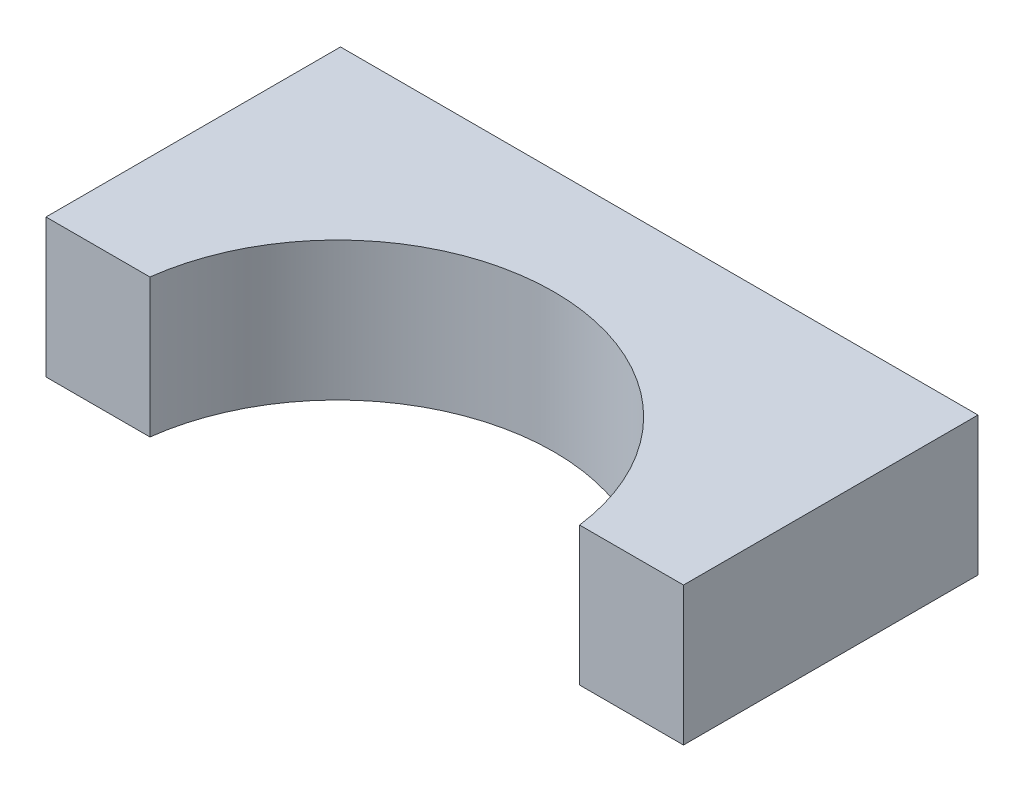
ISO-10303-21;
HEADER;
FILE_DESCRIPTION(('STEP AP214'),'2;1');
FILE_NAME('part.step','',(''),(''),'','','');
FILE_SCHEMA(('AUTOMOTIVE_DESIGN { 1 0 10303 214 1 1 1 1 }'));
ENDSEC;
DATA;
#1=APPLICATION_CONTEXT('core data for automotive mechanical design processes');
#2=APPLICATION_PROTOCOL_DEFINITION('international standard','automotive_design',2000,#1);
#3=PRODUCT_CONTEXT('',#1,'mechanical');
#4=PRODUCT('Part','Part','',(#3));
#5=PRODUCT_RELATED_PRODUCT_CATEGORY('part','',(#4));
#6=PRODUCT_DEFINITION_FORMATION('','',#4);
#7=PRODUCT_DEFINITION_CONTEXT('part definition',#1,'design');
#8=PRODUCT_DEFINITION('design','',#6,#7);
#9=PRODUCT_DEFINITION_SHAPE('','',#8);
#10=(LENGTH_UNIT() NAMED_UNIT(*) SI_UNIT(.MILLI.,.METRE.));
#11=(NAMED_UNIT(*) PLANE_ANGLE_UNIT() SI_UNIT($,.RADIAN.));
#12=(NAMED_UNIT(*) SI_UNIT($,.STERADIAN.) SOLID_ANGLE_UNIT());
#13=UNCERTAINTY_MEASURE_WITH_UNIT(LENGTH_MEASURE(1.E-05),#10,'distance_accuracy_value','');
#14=(GEOMETRIC_REPRESENTATION_CONTEXT(3) GLOBAL_UNCERTAINTY_ASSIGNED_CONTEXT((#13)) GLOBAL_UNIT_ASSIGNED_CONTEXT((#10,
#11,#12)) REPRESENTATION_CONTEXT('',''));
#15=CARTESIAN_POINT('',(0.,0.,0.));
#16=DIRECTION('',(0.,0.,1.));
#17=DIRECTION('',(1.,0.,0.));
#18=AXIS2_PLACEMENT_3D('',#15,#16,#17);
#19=CARTESIAN_POINT('',(24.13,-10.16,8.89));
#20=DIRECTION('',(0.,0.,1.));
#21=DIRECTION('',(1.,0.,0.));
#22=AXIS2_PLACEMENT_3D('',#19,#20,#21);
#23=PLANE('',#22);
#24=DIRECTION('',(1.,0.,0.));
#25=VECTOR('',#24,1.);
#26=CARTESIAN_POINT('',(24.13,0.,8.89));
#27=LINE('',#26,#25);
#28=CARTESIAN_POINT('',(24.13,0.,8.89));
#29=VERTEX_POINT('',#28);
#30=CARTESIAN_POINT('',(31.75,0.,8.89));
#31=VERTEX_POINT('',#30);
#32=EDGE_CURVE('E121',#29,#31,#27,.T.);
#33=ORIENTED_EDGE('',*,*,#32,.F.);
#34=DIRECTION('',(0.,1.,0.));
#35=VECTOR('',#34,1.);
#36=CARTESIAN_POINT('',(24.13,-10.16,8.89));
#37=LINE('',#36,#35);
#38=CARTESIAN_POINT('',(24.13,-10.16,8.89));
#39=VERTEX_POINT('',#38);
#40=EDGE_CURVE('E11',#39,#29,#37,.T.);
#41=ORIENTED_EDGE('',*,*,#40,.F.);
#42=DIRECTION('',(1.,0.,0.));
#43=VECTOR('',#42,1.);
#44=CARTESIAN_POINT('',(24.13,-10.16,8.89));
#45=LINE('',#44,#43);
#46=CARTESIAN_POINT('',(31.75,-10.16,8.89));
#47=VERTEX_POINT('',#46);
#48=EDGE_CURVE('E137',#39,#47,#45,.T.);
#49=ORIENTED_EDGE('',*,*,#48,.T.);
#50=DIRECTION('',(0.,1.,0.));
#51=VECTOR('',#50,1.);
#52=CARTESIAN_POINT('',(31.75,-10.16,8.89));
#53=LINE('',#52,#51);
#54=EDGE_CURVE('E45',#47,#31,#53,.T.);
#55=ORIENTED_EDGE('',*,*,#54,.T.);
#56=EDGE_LOOP('',(#33,#41,#49,#55));
#57=FACE_BOUND('',#56,.T.);
#58=ADVANCED_FACE('F39',(#57),#23,.T.);
#59=CARTESIAN_POINT('',(8.382,-10.16,10.8940261974336));
#60=DIRECTION('',(0.,1.,0.));
#61=DIRECTION('',(0.,0.,1.));
#62=AXIS2_PLACEMENT_3D('',#59,#60,#61);
#63=CYLINDRICAL_SURFACE('',#62,15.875);
#64=CARTESIAN_POINT('',(8.382,0.,10.8940261974336));
#65=DIRECTION('',(0.,-1.,0.));
#66=DIRECTION('',(0.,0.,1.));
#67=AXIS2_PLACEMENT_3D('',#64,#65,#66);
#68=CIRCLE('',#67,15.875);
#69=CARTESIAN_POINT('',(-7.366,0.,8.89));
#70=VERTEX_POINT('',#69);
#71=EDGE_CURVE('E140',#70,#29,#68,.T.);
#72=ORIENTED_EDGE('',*,*,#71,.F.);
#73=DIRECTION('',(0.,1.,0.));
#74=VECTOR('',#73,1.);
#75=CARTESIAN_POINT('',(-7.366,-10.16,8.89));
#76=LINE('',#75,#74);
#77=CARTESIAN_POINT('',(-7.366,-10.16,8.89));
#78=VERTEX_POINT('',#77);
#79=EDGE_CURVE('E48',#78,#70,#76,.T.);
#80=ORIENTED_EDGE('',*,*,#79,.F.);
#81=CARTESIAN_POINT('',(8.382,-10.16,10.8940261974336));
#82=DIRECTION('',(0.,-1.,0.));
#83=DIRECTION('',(0.,0.,1.));
#84=AXIS2_PLACEMENT_3D('',#81,#82,#83);
#85=CIRCLE('',#84,15.875);
#86=EDGE_CURVE('E112',#78,#39,#85,.T.);
#87=ORIENTED_EDGE('',*,*,#86,.T.);
#88=ORIENTED_EDGE('',*,*,#40,.T.);
#89=EDGE_LOOP('',(#72,#80,#87,#88));
#90=FACE_BOUND('',#89,.T.);
#91=ADVANCED_FACE('F150',(#90),#63,.F.);
#92=CARTESIAN_POINT('',(-14.986,-10.16,8.89));
#93=DIRECTION('',(0.,0.,1.));
#94=DIRECTION('',(1.,0.,0.));
#95=AXIS2_PLACEMENT_3D('',#92,#93,#94);
#96=PLANE('',#95);
#97=DIRECTION('',(1.,0.,0.));
#98=VECTOR('',#97,1.);
#99=CARTESIAN_POINT('',(-14.986,0.,8.89));
#100=LINE('',#99,#98);
#101=CARTESIAN_POINT('',(-14.986,0.,8.89));
#102=VERTEX_POINT('',#101);
#103=EDGE_CURVE('E103',#102,#70,#100,.T.);
#104=ORIENTED_EDGE('',*,*,#103,.F.);
#105=DIRECTION('',(0.,1.,0.));
#106=VECTOR('',#105,1.);
#107=CARTESIAN_POINT('',(-14.986,-10.16,8.89));
#108=LINE('',#107,#106);
#109=CARTESIAN_POINT('',(-14.986,-10.16,8.89));
#110=VERTEX_POINT('',#109);
#111=EDGE_CURVE('E98',#110,#102,#108,.T.);
#112=ORIENTED_EDGE('',*,*,#111,.F.);
#113=DIRECTION('',(1.,0.,0.));
#114=VECTOR('',#113,1.);
#115=CARTESIAN_POINT('',(-14.986,-10.16,8.89));
#116=LINE('',#115,#114);
#117=EDGE_CURVE('E100',#110,#78,#116,.T.);
#118=ORIENTED_EDGE('',*,*,#117,.T.);
#119=ORIENTED_EDGE('',*,*,#79,.T.);
#120=EDGE_LOOP('',(#104,#112,#118,#119));
#121=FACE_BOUND('',#120,.T.);
#122=ADVANCED_FACE('F96',(#121),#96,.T.);
#123=CARTESIAN_POINT('',(-14.986,-10.16,-12.7));
#124=DIRECTION('',(-1.,0.,0.));
#125=DIRECTION('',(0.,0.,1.));
#126=AXIS2_PLACEMENT_3D('',#123,#124,#125);
#127=PLANE('',#126);
#128=DIRECTION('',(0.,0.,1.));
#129=VECTOR('',#128,1.);
#130=CARTESIAN_POINT('',(-14.986,0.,-12.7));
#131=LINE('',#130,#129);
#132=CARTESIAN_POINT('',(-14.986,0.,-12.7));
#133=VERTEX_POINT('',#132);
#134=EDGE_CURVE('E133',#133,#102,#131,.T.);
#135=ORIENTED_EDGE('',*,*,#134,.F.);
#136=DIRECTION('',(0.,1.,0.));
#137=VECTOR('',#136,1.);
#138=CARTESIAN_POINT('',(-14.986,-10.16,-12.7));
#139=LINE('',#138,#137);
#140=CARTESIAN_POINT('',(-14.986,-10.16,-12.7));
#141=VERTEX_POINT('',#140);
#142=EDGE_CURVE('E106',#141,#133,#139,.T.);
#143=ORIENTED_EDGE('',*,*,#142,.F.);
#144=DIRECTION('',(0.,0.,1.));
#145=VECTOR('',#144,1.);
#146=CARTESIAN_POINT('',(-14.986,-10.16,-12.7));
#147=LINE('',#146,#145);
#148=EDGE_CURVE('E115',#141,#110,#147,.T.);
#149=ORIENTED_EDGE('',*,*,#148,.T.);
#150=ORIENTED_EDGE('',*,*,#111,.T.);
#151=EDGE_LOOP('',(#135,#143,#149,#150));
#152=FACE_BOUND('',#151,.T.);
#153=ADVANCED_FACE('F116',(#152),#127,.T.);
#154=CARTESIAN_POINT('',(-14.986,-10.16,-12.7));
#155=DIRECTION('',(0.,0.,-1.));
#156=DIRECTION('',(-1.,0.,0.));
#157=AXIS2_PLACEMENT_3D('',#154,#155,#156);
#158=PLANE('',#157);
#159=CARTESIAN_POINT('',(27.94,-5.08,-12.7));
#160=DIRECTION('',(0.,0.,-1.));
#161=DIRECTION('',(-1.,0.,0.));
#162=AXIS2_PLACEMENT_3D('',#159,#160,#161);
#163=CIRCLE('',#162,1.0033);
#164=CARTESIAN_POINT('',(26.9367,-5.08,-12.7));
#165=VERTEX_POINT('',#164);
#166=EDGE_CURVE('E188',#165,#165,#163,.T.);
#167=ORIENTED_EDGE('',*,*,#166,.F.);
#168=EDGE_LOOP('',(#167));
#169=FACE_BOUND('',#168,.T.);
#170=CARTESIAN_POINT('',(-11.176,-5.08,-12.7));
#171=DIRECTION('',(0.,0.,-1.));
#172=DIRECTION('',(-1.,0.,0.));
#173=AXIS2_PLACEMENT_3D('',#170,#171,#172);
#174=CIRCLE('',#173,1.0033);
#175=CARTESIAN_POINT('',(-12.1793,-5.08,-12.7));
#176=VERTEX_POINT('',#175);
#177=EDGE_CURVE('E200',#176,#176,#174,.T.);
#178=ORIENTED_EDGE('',*,*,#177,.F.);
#179=EDGE_LOOP('',(#178));
#180=FACE_BOUND('',#179,.T.);
#181=DIRECTION('',(-1.,0.,0.));
#182=VECTOR('',#181,1.);
#183=CARTESIAN_POINT('',(-14.986,0.,-12.7));
#184=LINE('',#183,#182);
#185=CARTESIAN_POINT('',(31.75,0.,-12.7));
#186=VERTEX_POINT('',#185);
#187=EDGE_CURVE('E134',#186,#133,#184,.T.);
#188=ORIENTED_EDGE('',*,*,#187,.F.);
#189=DIRECTION('',(0.,1.,0.));
#190=VECTOR('',#189,1.);
#191=CARTESIAN_POINT('',(31.75,-10.16,-12.7));
#192=LINE('',#191,#190);
#193=CARTESIAN_POINT('',(31.75,-10.16,-12.7));
#194=VERTEX_POINT('',#193);
#195=EDGE_CURVE('E145',#194,#186,#192,.T.);
#196=ORIENTED_EDGE('',*,*,#195,.F.);
#197=DIRECTION('',(-1.,0.,0.));
#198=VECTOR('',#197,1.);
#199=CARTESIAN_POINT('',(-14.986,-10.16,-12.7));
#200=LINE('',#199,#198);
#201=EDGE_CURVE('E120',#194,#141,#200,.T.);
#202=ORIENTED_EDGE('',*,*,#201,.T.);
#203=ORIENTED_EDGE('',*,*,#142,.T.);
#204=EDGE_LOOP('',(#188,#196,#202,#203));
#205=FACE_BOUND('',#204,.T.);
#206=ADVANCED_FACE('F159',(#169,#180,#205),#158,.T.);
#207=CARTESIAN_POINT('',(31.75,-10.16,-12.7));
#208=DIRECTION('',(1.,0.,0.));
#209=DIRECTION('',(0.,0.,-1.));
#210=AXIS2_PLACEMENT_3D('',#207,#208,#209);
#211=PLANE('',#210);
#212=DIRECTION('',(0.,0.,-1.));
#213=VECTOR('',#212,1.);
#214=CARTESIAN_POINT('',(31.75,0.,-12.7));
#215=LINE('',#214,#213);
#216=EDGE_CURVE('E130',#31,#186,#215,.T.);
#217=ORIENTED_EDGE('',*,*,#216,.F.);
#218=ORIENTED_EDGE('',*,*,#54,.F.);
#219=DIRECTION('',(0.,0.,-1.));
#220=VECTOR('',#219,1.);
#221=CARTESIAN_POINT('',(31.75,-10.16,-12.7));
#222=LINE('',#221,#220);
#223=EDGE_CURVE('E118',#47,#194,#222,.T.);
#224=ORIENTED_EDGE('',*,*,#223,.T.);
#225=ORIENTED_EDGE('',*,*,#195,.T.);
#226=EDGE_LOOP('',(#217,#218,#224,#225));
#227=FACE_BOUND('',#226,.T.);
#228=ADVANCED_FACE('F144',(#227),#211,.T.);
#229=CARTESIAN_POINT('',(8.382,-10.16,10.8940261974336));
#230=DIRECTION('',(0.,1.,0.));
#231=DIRECTION('',(0.,0.,1.));
#232=AXIS2_PLACEMENT_3D('',#229,#230,#231);
#233=PLANE('',#232);
#234=ORIENTED_EDGE('',*,*,#48,.F.);
#235=ORIENTED_EDGE('',*,*,#86,.F.);
#236=ORIENTED_EDGE('',*,*,#117,.F.);
#237=ORIENTED_EDGE('',*,*,#148,.F.);
#238=ORIENTED_EDGE('',*,*,#201,.F.);
#239=ORIENTED_EDGE('',*,*,#223,.F.);
#240=EDGE_LOOP('',(#234,#235,#236,#237,#238,#239));
#241=FACE_BOUND('',#240,.T.);
#242=ADVANCED_FACE('F109',(#241),#233,.F.);
#243=CARTESIAN_POINT('',(8.382,0.,10.8940261974336));
#244=DIRECTION('',(0.,1.,0.));
#245=DIRECTION('',(0.,0.,1.));
#246=AXIS2_PLACEMENT_3D('',#243,#244,#245);
#247=PLANE('',#246);
#248=ORIENTED_EDGE('',*,*,#32,.T.);
#249=ORIENTED_EDGE('',*,*,#216,.T.);
#250=ORIENTED_EDGE('',*,*,#187,.T.);
#251=ORIENTED_EDGE('',*,*,#134,.T.);
#252=ORIENTED_EDGE('',*,*,#103,.T.);
#253=ORIENTED_EDGE('',*,*,#71,.T.);
#254=EDGE_LOOP('',(#248,#249,#250,#251,#252,#253));
#255=FACE_BOUND('',#254,.T.);
#256=ADVANCED_FACE('F147',(#255),#247,.T.);
#257=CARTESIAN_POINT('',(-11.176,-5.08,-8.636));
#258=DIRECTION('',(0.,0.,-1.));
#259=DIRECTION('',(-1.,0.,0.));
#260=AXIS2_PLACEMENT_3D('',#257,#258,#259);
#261=CYLINDRICAL_SURFACE('',#260,1.0033);
#262=CARTESIAN_POINT('',(-11.176,-5.08,-8.636));
#263=DIRECTION('',(0.,0.,-1.));
#264=DIRECTION('',(-1.,0.,0.));
#265=AXIS2_PLACEMENT_3D('',#262,#263,#264);
#266=CIRCLE('',#265,1.0033);
#267=CARTESIAN_POINT('',(-12.1793,-5.08,-8.636));
#268=VERTEX_POINT('',#267);
#269=EDGE_CURVE('E194',#268,#268,#266,.T.);
#270=ORIENTED_EDGE('',*,*,#269,.F.);
#271=EDGE_LOOP('',(#270));
#272=FACE_BOUND('',#271,.T.);
#273=ORIENTED_EDGE('',*,*,#177,.T.);
#274=EDGE_LOOP('',(#273));
#275=FACE_BOUND('',#274,.T.);
#276=ADVANCED_FACE('F167',(#272,#275),#261,.F.);
#277=CARTESIAN_POINT('',(0.,0.,-8.636));
#278=DIRECTION('',(0.,0.,-1.));
#279=DIRECTION('',(-1.,0.,0.));
#280=AXIS2_PLACEMENT_3D('',#277,#278,#279);
#281=PLANE('',#280);
#282=ORIENTED_EDGE('',*,*,#269,.T.);
#283=EDGE_LOOP('',(#282));
#284=FACE_BOUND('',#283,.T.);
#285=ADVANCED_FACE('F172',(#284),#281,.T.);
#286=CARTESIAN_POINT('',(27.94,-5.08,-8.636));
#287=DIRECTION('',(0.,0.,-1.));
#288=DIRECTION('',(-1.,0.,0.));
#289=AXIS2_PLACEMENT_3D('',#286,#287,#288);
#290=CYLINDRICAL_SURFACE('',#289,1.0033);
#291=CARTESIAN_POINT('',(27.94,-5.08,-8.636));
#292=DIRECTION('',(0.,0.,-1.));
#293=DIRECTION('',(-1.,0.,0.));
#294=AXIS2_PLACEMENT_3D('',#291,#292,#293);
#295=CIRCLE('',#294,1.0033);
#296=CARTESIAN_POINT('',(26.9367,-5.08,-8.636));
#297=VERTEX_POINT('',#296);
#298=EDGE_CURVE('E129',#297,#297,#295,.T.);
#299=ORIENTED_EDGE('',*,*,#298,.F.);
#300=EDGE_LOOP('',(#299));
#301=FACE_BOUND('',#300,.T.);
#302=ORIENTED_EDGE('',*,*,#166,.T.);
#303=EDGE_LOOP('',(#302));
#304=FACE_BOUND('',#303,.T.);
#305=ADVANCED_FACE('F178',(#301,#304),#290,.F.);
#306=CARTESIAN_POINT('',(0.,0.,-8.636));
#307=DIRECTION('',(0.,0.,-1.));
#308=DIRECTION('',(-1.,0.,0.));
#309=AXIS2_PLACEMENT_3D('',#306,#307,#308);
#310=PLANE('',#309);
#311=ORIENTED_EDGE('',*,*,#298,.T.);
#312=EDGE_LOOP('',(#311));
#313=FACE_BOUND('',#312,.T.);
#314=ADVANCED_FACE('F185',(#313),#310,.T.);
#315=CLOSED_SHELL('',(#58,#91,#122,#153,#206,#228,#242,#256,#276,#285,#305,#314));
#316=MANIFOLD_SOLID_BREP('B2',#315);
#317=ADVANCED_BREP_SHAPE_REPRESENTATION('',(#18,#316),#14);
#318=SHAPE_DEFINITION_REPRESENTATION(#9,#317);
ENDSEC;
END-ISO-10303-21;
